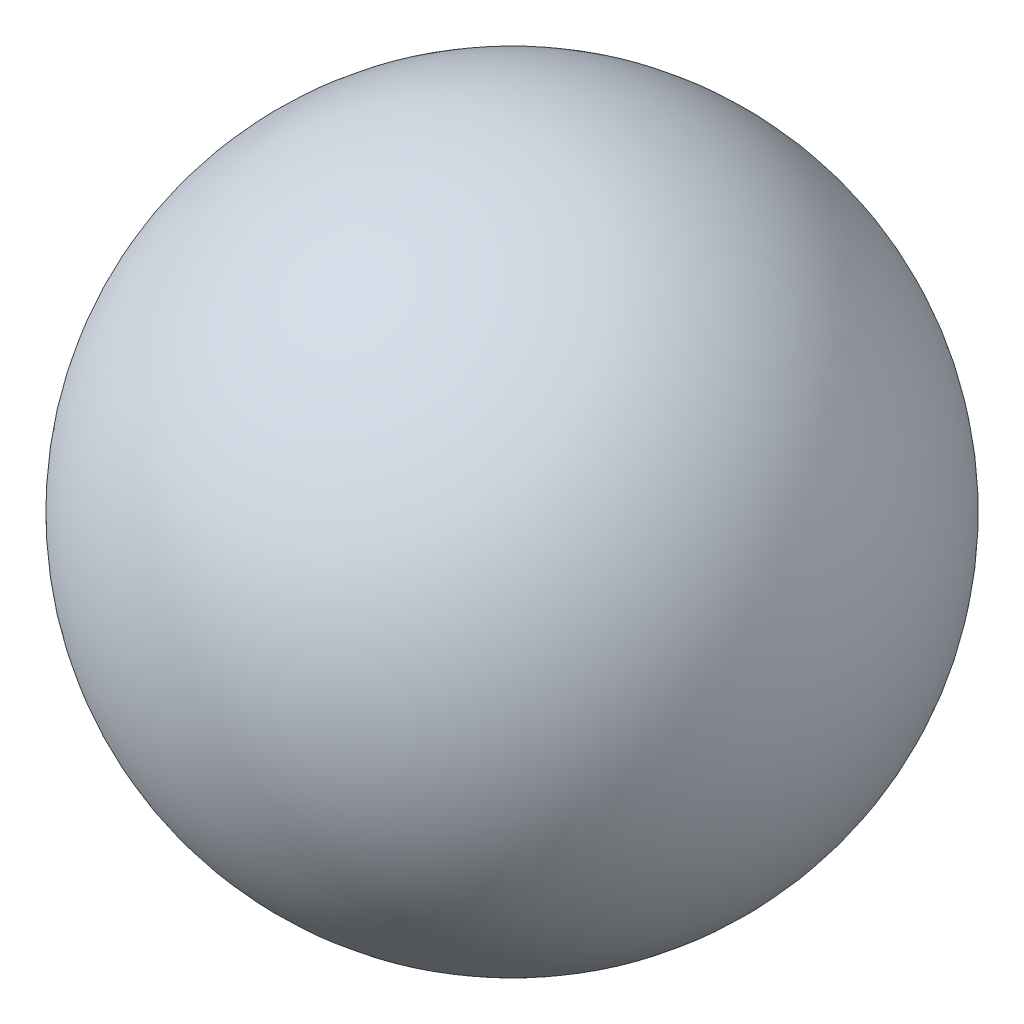
ISO-10303-21;
HEADER;
FILE_DESCRIPTION(('STEP AP214'),'2;1');
FILE_NAME('part.step','',(''),(''),'','','');
FILE_SCHEMA(('AUTOMOTIVE_DESIGN { 1 0 10303 214 1 1 1 1 }'));
ENDSEC;
DATA;
#1=APPLICATION_CONTEXT('core data for automotive mechanical design processes');
#2=APPLICATION_PROTOCOL_DEFINITION('international standard','automotive_design',2000,#1);
#3=PRODUCT_CONTEXT('',#1,'mechanical');
#4=PRODUCT('Part','Part','',(#3));
#5=PRODUCT_RELATED_PRODUCT_CATEGORY('part','',(#4));
#6=PRODUCT_DEFINITION_FORMATION('','',#4);
#7=PRODUCT_DEFINITION_CONTEXT('part definition',#1,'design');
#8=PRODUCT_DEFINITION('design','',#6,#7);
#9=PRODUCT_DEFINITION_SHAPE('','',#8);
#10=(LENGTH_UNIT() NAMED_UNIT(*) SI_UNIT(.MILLI.,.METRE.));
#11=(NAMED_UNIT(*) PLANE_ANGLE_UNIT() SI_UNIT($,.RADIAN.));
#12=(NAMED_UNIT(*) SI_UNIT($,.STERADIAN.) SOLID_ANGLE_UNIT());
#13=UNCERTAINTY_MEASURE_WITH_UNIT(LENGTH_MEASURE(1.E-05),#10,'distance_accuracy_value','');
#14=(GEOMETRIC_REPRESENTATION_CONTEXT(3) GLOBAL_UNCERTAINTY_ASSIGNED_CONTEXT((#13)) GLOBAL_UNIT_ASSIGNED_CONTEXT((#10,
#11,#12)) REPRESENTATION_CONTEXT('',''));
#15=CARTESIAN_POINT('',(0.,0.,0.));
#16=DIRECTION('',(0.,0.,1.));
#17=DIRECTION('',(1.,0.,0.));
#18=AXIS2_PLACEMENT_3D('',#15,#16,#17);
#19=CARTESIAN_POINT('',(0.,0.,0.));
#20=DIRECTION('',(0.,1.,0.));
#21=DIRECTION('',(1.,0.,0.));
#22=AXIS2_PLACEMENT_3D('',#19,#20,#21);
#23=SPHERICAL_SURFACE('',#22,4.);
#24=CARTESIAN_POINT('',(0.,4.,0.));
#25=VERTEX_POINT('',#24);
#26=VERTEX_LOOP('',#25);
#27=FACE_BOUND('',#26,.T.);
#28=ADVANCED_FACE('F32',(#27),#23,.T.);
#29=CLOSED_SHELL('',(#28));
#30=MANIFOLD_SOLID_BREP('B2',#29);
#31=ADVANCED_BREP_SHAPE_REPRESENTATION('',(#18,#30),#14);
#32=SHAPE_DEFINITION_REPRESENTATION(#9,#31);
ENDSEC;
END-ISO-10303-21;
